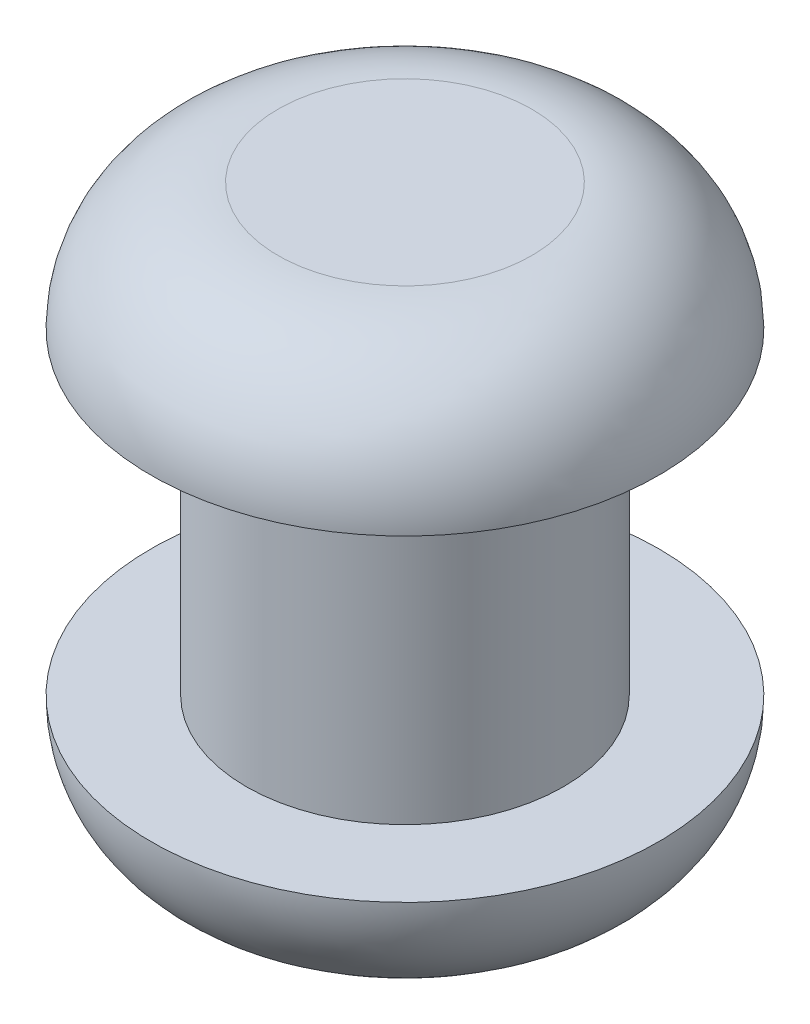
ISO-10303-21;
HEADER;
FILE_DESCRIPTION(('STEP AP214'),'2;1');
FILE_NAME('part.step','',(''),(''),'','','');
FILE_SCHEMA(('AUTOMOTIVE_DESIGN { 1 0 10303 214 1 1 1 1 }'));
ENDSEC;
DATA;
#1=APPLICATION_CONTEXT('core data for automotive mechanical design processes');
#2=APPLICATION_PROTOCOL_DEFINITION('international standard','automotive_design',2000,#1);
#3=PRODUCT_CONTEXT('',#1,'mechanical');
#4=PRODUCT('Part','Part','',(#3));
#5=PRODUCT_RELATED_PRODUCT_CATEGORY('part','',(#4));
#6=PRODUCT_DEFINITION_FORMATION('','',#4);
#7=PRODUCT_DEFINITION_CONTEXT('part definition',#1,'design');
#8=PRODUCT_DEFINITION('design','',#6,#7);
#9=PRODUCT_DEFINITION_SHAPE('','',#8);
#10=(LENGTH_UNIT() NAMED_UNIT(*) SI_UNIT(.MILLI.,.METRE.));
#11=(NAMED_UNIT(*) PLANE_ANGLE_UNIT() SI_UNIT($,.RADIAN.));
#12=(NAMED_UNIT(*) SI_UNIT($,.STERADIAN.) SOLID_ANGLE_UNIT());
#13=UNCERTAINTY_MEASURE_WITH_UNIT(LENGTH_MEASURE(1.E-05),#10,'distance_accuracy_value','');
#14=(GEOMETRIC_REPRESENTATION_CONTEXT(3) GLOBAL_UNCERTAINTY_ASSIGNED_CONTEXT((#13)) GLOBAL_UNIT_ASSIGNED_CONTEXT((#10,
#11,#12)) REPRESENTATION_CONTEXT('',''));
#15=CARTESIAN_POINT('',(0.,0.,0.));
#16=DIRECTION('',(0.,0.,1.));
#17=DIRECTION('',(1.,0.,0.));
#18=AXIS2_PLACEMENT_3D('',#15,#16,#17);
#19=CARTESIAN_POINT('',(0.,2.5,2.50000000000001));
#20=DIRECTION('',(0.,1.,0.));
#21=DIRECTION('',(0.,0.,1.));
#22=AXIS2_PLACEMENT_3D('',#19,#20,#21);
#23=PLANE('',#22);
#24=CARTESIAN_POINT('',(0.,2.5,0.));
#25=DIRECTION('',(0.,-1.,0.));
#26=DIRECTION('',(0.,0.,-1.));
#27=AXIS2_PLACEMENT_3D('',#24,#25,#26);
#28=CIRCLE('',#27,2.50000000000001);
#29=CARTESIAN_POINT('',(0.,2.5,-2.50000000000001));
#30=VERTEX_POINT('',#29);
#31=EDGE_CURVE('E62',#30,#30,#28,.T.);
#32=ORIENTED_EDGE('',*,*,#31,.F.);
#33=EDGE_LOOP('',(#32));
#34=FACE_BOUND('',#33,.T.);
#35=CARTESIAN_POINT('',(0.,2.5,0.));
#36=DIRECTION('',(0.,-1.,0.));
#37=DIRECTION('',(0.,0.,-1.));
#38=AXIS2_PLACEMENT_3D('',#35,#36,#37);
#39=CIRCLE('',#38,4.00000000000001);
#40=CARTESIAN_POINT('',(0.,2.5,-4.00000000000001));
#41=VERTEX_POINT('',#40);
#42=EDGE_CURVE('E10',#41,#41,#39,.T.);
#43=ORIENTED_EDGE('',*,*,#42,.T.);
#44=EDGE_LOOP('',(#43));
#45=FACE_BOUND('',#44,.T.);
#46=ADVANCED_FACE('F39',(#34,#45),#23,.F.);
#47=CARTESIAN_POINT('',(0.,2.5,0.));
#48=DIRECTION('',(0.,-1.,0.));
#49=DIRECTION('',(0.,0.,-1.));
#50=AXIS2_PLACEMENT_3D('',#47,#48,#49);
#51=TOROIDAL_SURFACE('',#50,2.00000000000001,2.);
#52=ORIENTED_EDGE('',*,*,#42,.F.);
#53=EDGE_LOOP('',(#52));
#54=FACE_BOUND('',#53,.T.);
#55=CARTESIAN_POINT('',(0.,4.5,0.));
#56=DIRECTION('',(0.,-1.,0.));
#57=DIRECTION('',(0.,0.,-1.));
#58=AXIS2_PLACEMENT_3D('',#55,#56,#57);
#59=CIRCLE('',#58,2.00000000000001);
#60=CARTESIAN_POINT('',(0.,4.5,-2.00000000000001));
#61=VERTEX_POINT('',#60);
#62=EDGE_CURVE('E44',#61,#61,#59,.T.);
#63=ORIENTED_EDGE('',*,*,#62,.T.);
#64=EDGE_LOOP('',(#63));
#65=FACE_BOUND('',#64,.T.);
#66=ADVANCED_FACE('F66',(#54,#65),#51,.T.);
#67=CARTESIAN_POINT('',(0.,4.5,2.00000000000001));
#68=DIRECTION('',(0.,-1.,0.));
#69=DIRECTION('',(0.,0.,-1.));
#70=AXIS2_PLACEMENT_3D('',#67,#68,#69);
#71=PLANE('',#70);
#72=ORIENTED_EDGE('',*,*,#62,.F.);
#73=EDGE_LOOP('',(#72));
#74=FACE_BOUND('',#73,.T.);
#75=ADVANCED_FACE('F74',(#74),#71,.F.);
#76=CARTESIAN_POINT('',(0.,-4.5,2.00000000000001));
#77=DIRECTION('',(0.,1.,0.));
#78=DIRECTION('',(0.,0.,1.));
#79=AXIS2_PLACEMENT_3D('',#76,#77,#78);
#80=PLANE('',#79);
#81=CARTESIAN_POINT('',(0.,-4.5,0.));
#82=DIRECTION('',(0.,-1.,0.));
#83=DIRECTION('',(0.,0.,-1.));
#84=AXIS2_PLACEMENT_3D('',#81,#82,#83);
#85=CIRCLE('',#84,2.00000000000001);
#86=CARTESIAN_POINT('',(0.,-4.5,-2.00000000000001));
#87=VERTEX_POINT('',#86);
#88=EDGE_CURVE('E47',#87,#87,#85,.T.);
#89=ORIENTED_EDGE('',*,*,#88,.T.);
#90=EDGE_LOOP('',(#89));
#91=FACE_BOUND('',#90,.T.);
#92=ADVANCED_FACE('F77',(#91),#80,.F.);
#93=CARTESIAN_POINT('',(0.,-2.5,0.));
#94=DIRECTION('',(0.,-1.,0.));
#95=DIRECTION('',(0.,0.,-1.));
#96=AXIS2_PLACEMENT_3D('',#93,#94,#95);
#97=TOROIDAL_SURFACE('',#96,2.00000000000001,2.);
#98=ORIENTED_EDGE('',*,*,#88,.F.);
#99=EDGE_LOOP('',(#98));
#100=FACE_BOUND('',#99,.T.);
#101=CARTESIAN_POINT('',(0.,-2.5,0.));
#102=DIRECTION('',(0.,-1.,0.));
#103=DIRECTION('',(0.,0.,-1.));
#104=AXIS2_PLACEMENT_3D('',#101,#102,#103);
#105=CIRCLE('',#104,4.);
#106=CARTESIAN_POINT('',(0.,-2.5,-4.));
#107=VERTEX_POINT('',#106);
#108=EDGE_CURVE('E52',#107,#107,#105,.T.);
#109=ORIENTED_EDGE('',*,*,#108,.T.);
#110=EDGE_LOOP('',(#109));
#111=FACE_BOUND('',#110,.T.);
#112=ADVANCED_FACE('F81',(#100,#111),#97,.T.);
#113=CARTESIAN_POINT('',(0.,-2.5,2.50000000000001));
#114=DIRECTION('',(0.,-1.,0.));
#115=DIRECTION('',(0.,0.,-1.));
#116=AXIS2_PLACEMENT_3D('',#113,#114,#115);
#117=PLANE('',#116);
#118=ORIENTED_EDGE('',*,*,#108,.F.);
#119=EDGE_LOOP('',(#118));
#120=FACE_BOUND('',#119,.T.);
#121=CARTESIAN_POINT('',(0.,-2.5,0.));
#122=DIRECTION('',(0.,-1.,0.));
#123=DIRECTION('',(0.,0.,-1.));
#124=AXIS2_PLACEMENT_3D('',#121,#122,#123);
#125=CIRCLE('',#124,2.50000000000001);
#126=CARTESIAN_POINT('',(0.,-2.5,-2.50000000000001));
#127=VERTEX_POINT('',#126);
#128=EDGE_CURVE('E59',#127,#127,#125,.T.);
#129=ORIENTED_EDGE('',*,*,#128,.T.);
#130=EDGE_LOOP('',(#129));
#131=FACE_BOUND('',#130,.T.);
#132=ADVANCED_FACE('F90',(#120,#131),#117,.F.);
#133=CARTESIAN_POINT('',(0.,-8.54659501082859,0.));
#134=DIRECTION('',(0.,-1.,0.));
#135=DIRECTION('',(0.,0.,-1.));
#136=AXIS2_PLACEMENT_3D('',#133,#134,#135);
#137=CYLINDRICAL_SURFACE('',#136,2.50000000000001);
#138=ORIENTED_EDGE('',*,*,#128,.F.);
#139=EDGE_LOOP('',(#138));
#140=FACE_BOUND('',#139,.T.);
#141=ORIENTED_EDGE('',*,*,#31,.T.);
#142=EDGE_LOOP('',(#141));
#143=FACE_BOUND('',#142,.T.);
#144=ADVANCED_FACE('F63',(#140,#143),#137,.T.);
#145=CLOSED_SHELL('',(#46,#66,#75,#92,#112,#132,#144));
#146=MANIFOLD_SOLID_BREP('B2',#145);
#147=ADVANCED_BREP_SHAPE_REPRESENTATION('',(#18,#146),#14);
#148=SHAPE_DEFINITION_REPRESENTATION(#9,#147);
ENDSEC;
END-ISO-10303-21;
